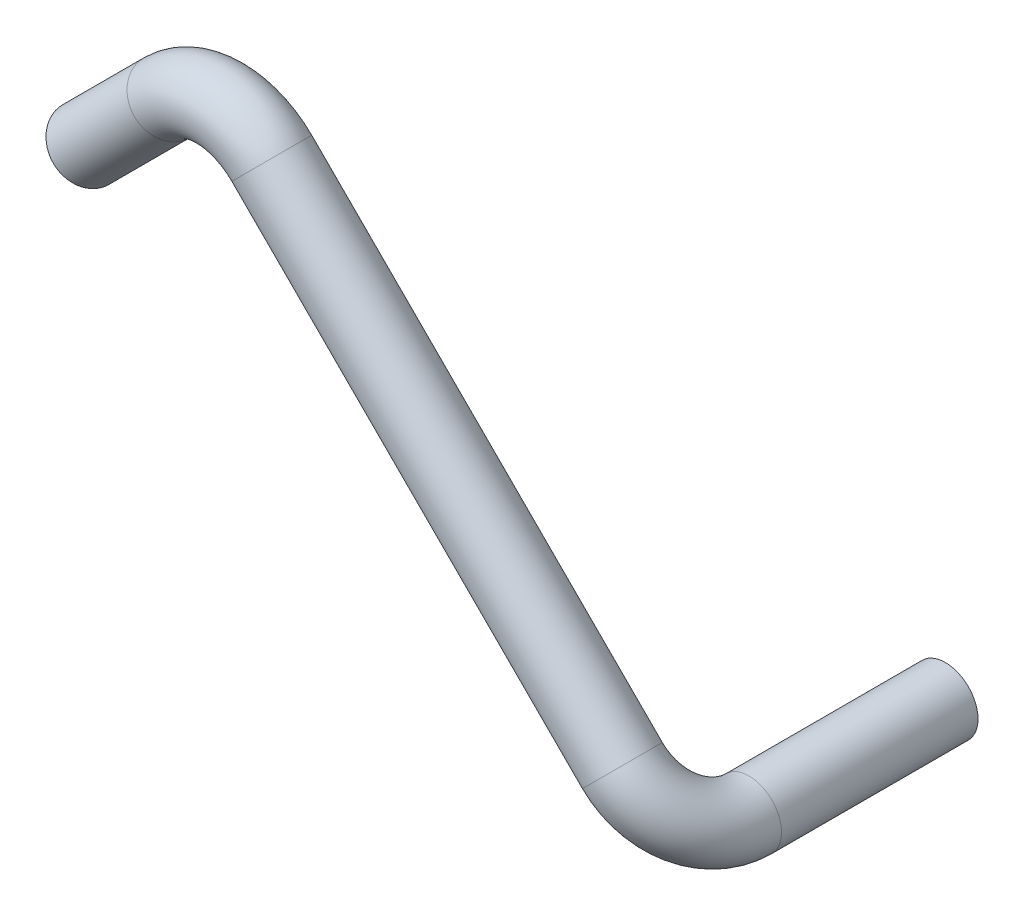
ISO-10303-21;
HEADER;
FILE_DESCRIPTION(('STEP AP214'),'2;1');
FILE_NAME('part.step','',(''),(''),'','','');
FILE_SCHEMA(('AUTOMOTIVE_DESIGN { 1 0 10303 214 1 1 1 1 }'));
ENDSEC;
DATA;
#1=APPLICATION_CONTEXT('core data for automotive mechanical design processes');
#2=APPLICATION_PROTOCOL_DEFINITION('international standard','automotive_design',2000,#1);
#3=PRODUCT_CONTEXT('',#1,'mechanical');
#4=PRODUCT('Part','Part','',(#3));
#5=PRODUCT_RELATED_PRODUCT_CATEGORY('part','',(#4));
#6=PRODUCT_DEFINITION_FORMATION('','',#4);
#7=PRODUCT_DEFINITION_CONTEXT('part definition',#1,'design');
#8=PRODUCT_DEFINITION('design','',#6,#7);
#9=PRODUCT_DEFINITION_SHAPE('','',#8);
#10=(LENGTH_UNIT() NAMED_UNIT(*) SI_UNIT(.MILLI.,.METRE.));
#11=(NAMED_UNIT(*) PLANE_ANGLE_UNIT() SI_UNIT($,.RADIAN.));
#12=(NAMED_UNIT(*) SI_UNIT($,.STERADIAN.) SOLID_ANGLE_UNIT());
#13=UNCERTAINTY_MEASURE_WITH_UNIT(LENGTH_MEASURE(1.E-05),#10,'distance_accuracy_value','');
#14=(GEOMETRIC_REPRESENTATION_CONTEXT(3) GLOBAL_UNCERTAINTY_ASSIGNED_CONTEXT((#13)) GLOBAL_UNIT_ASSIGNED_CONTEXT((#10,
#11,#12)) REPRESENTATION_CONTEXT('',''));
#15=CARTESIAN_POINT('',(0.,0.,0.));
#16=DIRECTION('',(0.,0.,1.));
#17=DIRECTION('',(1.,0.,0.));
#18=AXIS2_PLACEMENT_3D('',#15,#16,#17);
#19=CARTESIAN_POINT('',(0.,0.,0.));
#20=DIRECTION('',(0.,0.,1.));
#21=DIRECTION('',(1.,0.,0.));
#22=AXIS2_PLACEMENT_3D('',#19,#20,#21);
#23=PLANE('',#22);
#24=CARTESIAN_POINT('',(0.,0.,0.));
#25=DIRECTION('',(0.,0.,1.));
#26=DIRECTION('',(1.,0.,0.));
#27=AXIS2_PLACEMENT_3D('',#24,#25,#26);
#28=CIRCLE('',#27,16.764);
#29=CARTESIAN_POINT('',(16.764,0.,0.));
#30=VERTEX_POINT('',#29);
#31=EDGE_CURVE('E10',#30,#30,#28,.T.);
#32=ORIENTED_EDGE('',*,*,#31,.F.);
#33=EDGE_LOOP('',(#32));
#34=FACE_BOUND('',#33,.T.);
#35=CARTESIAN_POINT('',(0.,0.,0.));
#36=DIRECTION('',(0.,0.,1.));
#37=DIRECTION('',(1.,0.,0.));
#38=AXIS2_PLACEMENT_3D('',#35,#36,#37);
#39=CIRCLE('',#38,13.3858);
#40=CARTESIAN_POINT('',(13.3858,0.,0.));
#41=VERTEX_POINT('',#40);
#42=EDGE_CURVE('E38',#41,#41,#39,.T.);
#43=ORIENTED_EDGE('',*,*,#42,.T.);
#44=EDGE_LOOP('',(#43));
#45=FACE_BOUND('',#44,.T.);
#46=ADVANCED_FACE('F31',(#34,#45),#23,.F.);
#47=CARTESIAN_POINT('',(0.,0.,95.));
#48=DIRECTION('',(0.,0.,-1.));
#49=DIRECTION('',(-1.,0.,0.));
#50=AXIS2_PLACEMENT_3D('',#47,#48,#49);
#51=CYLINDRICAL_SURFACE('',#50,16.764);
#52=ORIENTED_EDGE('',*,*,#31,.T.);
#53=EDGE_LOOP('',(#52));
#54=FACE_BOUND('',#53,.T.);
#55=CARTESIAN_POINT('',(0.,0.,100.980008255021));
#56=DIRECTION('',(0.,0.,1.));
#57=DIRECTION('',(1.,0.,0.));
#58=AXIS2_PLACEMENT_3D('',#55,#56,#57);
#59=CIRCLE('',#58,16.764);
#60=CARTESIAN_POINT('',(11.8539380798113,-11.8539380798113,100.980008255021));
#61=VERTEX_POINT('',#60);
#62=EDGE_CURVE('E42',#61,#61,#59,.T.);
#63=ORIENTED_EDGE('',*,*,#62,.F.);
#64=EDGE_LOOP('',(#63));
#65=FACE_BOUND('',#64,.T.);
#66=ADVANCED_FACE('F33',(#54,#65),#51,.T.);
#67=CARTESIAN_POINT('',(0.,0.,95.));
#68=DIRECTION('',(0.,0.,-1.));
#69=DIRECTION('',(-1.,0.,0.));
#70=AXIS2_PLACEMENT_3D('',#67,#68,#69);
#71=CYLINDRICAL_SURFACE('',#70,13.3858);
#72=ORIENTED_EDGE('',*,*,#42,.F.);
#73=EDGE_LOOP('',(#72));
#74=FACE_BOUND('',#73,.T.);
#75=CARTESIAN_POINT('',(0.,0.,100.980008255021));
#76=DIRECTION('',(0.,0.,1.));
#77=DIRECTION('',(1.,0.,0.));
#78=AXIS2_PLACEMENT_3D('',#75,#76,#77);
#79=CIRCLE('',#78,13.3858);
#80=CARTESIAN_POINT('',(9.46518995160688,-9.46518995160688,100.980008255021));
#81=VERTEX_POINT('',#80);
#82=EDGE_CURVE('E51',#81,#81,#79,.T.);
#83=ORIENTED_EDGE('',*,*,#82,.T.);
#84=EDGE_LOOP('',(#83));
#85=FACE_BOUND('',#84,.T.);
#86=ADVANCED_FACE('F100',(#74,#85),#71,.F.);
#87=CARTESIAN_POINT('',(-26.9407683632075,26.9407683632075,100.980008255021));
#88=DIRECTION('',(0.707106781186548,0.707106781186548,0.));
#89=DIRECTION('',(-0.707106781186548,0.707106781186548,0.));
#90=AXIS2_PLACEMENT_3D('',#87,#88,#89);
#91=TOROIDAL_SURFACE('',#90,38.1,13.3858);
#92=CARTESIAN_POINT('',(-26.9407683632075,26.9407683632075,139.080008255021));
#93=DIRECTION('',(-0.707106781186548,0.707106781186547,0.));
#94=DIRECTION('',(-0.707106781186547,-0.707106781186548,0.));
#95=AXIS2_PLACEMENT_3D('',#92,#93,#94);
#96=CIRCLE('',#95,13.3858);
#97=CARTESIAN_POINT('',(-26.9407683632075,26.9407683632075,152.465808255021));
#98=VERTEX_POINT('',#97);
#99=EDGE_CURVE('E57',#98,#98,#96,.T.);
#100=CARTESIAN_POINT('',(-26.9407683632075,26.9407683632075,100.980008255021));
#101=DIRECTION('',(0.707106781186548,0.707106781186548,0.));
#102=DIRECTION('',(-0.707106781186548,0.707106781186548,0.));
#103=AXIS2_PLACEMENT_3D('',#100,#101,#102);
#104=CIRCLE('',#103,51.4858);
#105=EDGE_CURVE('',#98,#81,#104,.T.);
#106=ORIENTED_EDGE('',*,*,#99,.T.);
#107=ORIENTED_EDGE('',*,*,#82,.F.);
#108=ORIENTED_EDGE('',*,*,#105,.T.);
#109=ORIENTED_EDGE('',*,*,#105,.F.);
#110=EDGE_LOOP('',(#106,#108,#107,#109));
#111=FACE_BOUND('',#110,.T.);
#112=ADVANCED_FACE('F104',(#111),#91,.F.);
#113=CARTESIAN_POINT('',(-26.9407683632075,26.9407683632075,100.980008255021));
#114=DIRECTION('',(0.707106781186548,0.707106781186548,0.));
#115=DIRECTION('',(-0.707106781186548,0.707106781186548,0.));
#116=AXIS2_PLACEMENT_3D('',#113,#114,#115);
#117=TOROIDAL_SURFACE('',#116,38.1,16.764);
#118=CARTESIAN_POINT('',(-26.9407683632075,26.9407683632075,139.080008255021));
#119=DIRECTION('',(-0.707106781186548,0.707106781186548,0.));
#120=DIRECTION('',(0.5,0.5,0.707106781186548));
#121=AXIS2_PLACEMENT_3D('',#118,#119,#120);
#122=CIRCLE('',#121,16.764);
#123=CARTESIAN_POINT('',(-26.9407683632075,26.9407683632075,155.844008255021));
#124=VERTEX_POINT('',#123);
#125=EDGE_CURVE('E46',#124,#124,#122,.T.);
#126=CARTESIAN_POINT('',(-26.9407683632075,26.9407683632075,100.980008255021));
#127=DIRECTION('',(0.707106781186548,0.707106781186548,0.));
#128=DIRECTION('',(-0.707106781186548,0.707106781186548,0.));
#129=AXIS2_PLACEMENT_3D('',#126,#127,#128);
#130=CIRCLE('',#129,54.864);
#131=EDGE_CURVE('',#124,#61,#130,.T.);
#132=ORIENTED_EDGE('',*,*,#125,.F.);
#133=ORIENTED_EDGE('',*,*,#62,.T.);
#134=ORIENTED_EDGE('',*,*,#131,.T.);
#135=ORIENTED_EDGE('',*,*,#131,.F.);
#136=EDGE_LOOP('',(#132,#134,#133,#135));
#137=FACE_BOUND('',#136,.T.);
#138=ADVANCED_FACE('F106',(#137),#117,.T.);
#139=CARTESIAN_POINT('',(-207.18245502432,207.18245502432,139.080008255021));
#140=DIRECTION('',(0.707106781186548,-0.707106781186547,0.));
#141=DIRECTION('',(0.707106781186547,0.707106781186548,0.));
#142=AXIS2_PLACEMENT_3D('',#139,#140,#141);
#143=CYLINDRICAL_SURFACE('',#142,16.764);
#144=CARTESIAN_POINT('',(-207.18245502432,207.18245502432,139.080008255021));
#145=DIRECTION('',(-0.707106781186548,0.707106781186547,0.));
#146=DIRECTION('',(-0.707106781186547,-0.707106781186548,0.));
#147=AXIS2_PLACEMENT_3D('',#144,#145,#146);
#148=CIRCLE('',#147,16.764);
#149=CARTESIAN_POINT('',(-195.328516944508,219.036393104131,139.080008255021));
#150=VERTEX_POINT('',#149);
#151=EDGE_CURVE('E54',#150,#150,#148,.T.);
#152=ORIENTED_EDGE('',*,*,#151,.F.);
#153=EDGE_LOOP('',(#152));
#154=FACE_BOUND('',#153,.T.);
#155=ORIENTED_EDGE('',*,*,#125,.T.);
#156=EDGE_LOOP('',(#155));
#157=FACE_BOUND('',#156,.T.);
#158=ADVANCED_FACE('F109',(#154,#157),#143,.T.);
#159=CARTESIAN_POINT('',(-207.18245502432,207.18245502432,139.080008255021));
#160=DIRECTION('',(0.707106781186548,-0.707106781186547,0.));
#161=DIRECTION('',(0.707106781186547,0.707106781186548,0.));
#162=AXIS2_PLACEMENT_3D('',#159,#160,#161);
#163=CYLINDRICAL_SURFACE('',#162,13.3858);
#164=CARTESIAN_POINT('',(-207.18245502432,207.18245502432,139.080008255021));
#165=DIRECTION('',(-0.707106781186548,0.707106781186548,0.));
#166=DIRECTION('',(-0.707106781186548,-0.707106781186548,0.));
#167=AXIS2_PLACEMENT_3D('',#164,#165,#166);
#168=CIRCLE('',#167,13.3858);
#169=CARTESIAN_POINT('',(-197.717265072713,216.647644975927,139.080008255021));
#170=VERTEX_POINT('',#169);
#171=EDGE_CURVE('E63',#170,#170,#168,.T.);
#172=ORIENTED_EDGE('',*,*,#171,.T.);
#173=EDGE_LOOP('',(#172));
#174=FACE_BOUND('',#173,.T.);
#175=ORIENTED_EDGE('',*,*,#99,.F.);
#176=EDGE_LOOP('',(#175));
#177=FACE_BOUND('',#176,.T.);
#178=ADVANCED_FACE('F116',(#174,#177),#163,.F.);
#179=CARTESIAN_POINT('',(-234.123223387527,180.241686661112,139.080008255021));
#180=DIRECTION('',(0.,0.,-1.));
#181=DIRECTION('',(-1.,0.,0.));
#182=AXIS2_PLACEMENT_3D('',#179,#180,#181);
#183=TOROIDAL_SURFACE('',#182,38.0999999999998,13.3858);
#184=CARTESIAN_POINT('',(-261.063991750734,207.18245502432,139.080008255021));
#185=DIRECTION('',(-0.707106781186547,-0.707106781186548,0.));
#186=DIRECTION('',(0.707106781186548,-0.707106781186547,0.));
#187=AXIS2_PLACEMENT_3D('',#184,#185,#186);
#188=CIRCLE('',#187,13.3858);
#189=CARTESIAN_POINT('',(-270.529181702341,216.647644975927,139.080008255021));
#190=VERTEX_POINT('',#189);
#191=EDGE_CURVE('E70',#190,#190,#188,.T.);
#192=CARTESIAN_POINT('',(-234.123223387527,180.241686661112,139.080008255021));
#193=DIRECTION('',(0.,0.,-1.));
#194=DIRECTION('',(-1.,0.,0.));
#195=AXIS2_PLACEMENT_3D('',#192,#193,#194);
#196=CIRCLE('',#195,51.4857999999998);
#197=EDGE_CURVE('',#190,#170,#196,.T.);
#198=ORIENTED_EDGE('',*,*,#191,.T.);
#199=ORIENTED_EDGE('',*,*,#171,.F.);
#200=ORIENTED_EDGE('',*,*,#197,.T.);
#201=ORIENTED_EDGE('',*,*,#197,.F.);
#202=EDGE_LOOP('',(#198,#200,#199,#201));
#203=FACE_BOUND('',#202,.T.);
#204=ADVANCED_FACE('F91',(#203),#183,.F.);
#205=CARTESIAN_POINT('',(-234.123223387527,180.241686661112,139.080008255021));
#206=DIRECTION('',(0.,0.,-1.));
#207=DIRECTION('',(-1.,0.,0.));
#208=AXIS2_PLACEMENT_3D('',#205,#206,#207);
#209=TOROIDAL_SURFACE('',#208,38.0999999999998,16.764);
#210=CARTESIAN_POINT('',(-261.063991750734,207.18245502432,139.080008255021));
#211=DIRECTION('',(-0.707106781186547,-0.707106781186548,0.));
#212=DIRECTION('',(0.707106781186548,-0.707106781186547,0.));
#213=AXIS2_PLACEMENT_3D('',#210,#211,#212);
#214=CIRCLE('',#213,16.764);
#215=CARTESIAN_POINT('',(-272.917929830546,219.036393104131,139.080008255021));
#216=VERTEX_POINT('',#215);
#217=EDGE_CURVE('E60',#216,#216,#214,.T.);
#218=CARTESIAN_POINT('',(-234.123223387527,180.241686661112,139.080008255021));
#219=DIRECTION('',(0.,0.,-1.));
#220=DIRECTION('',(-1.,0.,0.));
#221=AXIS2_PLACEMENT_3D('',#218,#219,#220);
#222=CIRCLE('',#221,54.8639999999998);
#223=EDGE_CURVE('',#216,#150,#222,.T.);
#224=ORIENTED_EDGE('',*,*,#217,.F.);
#225=ORIENTED_EDGE('',*,*,#151,.T.);
#226=ORIENTED_EDGE('',*,*,#223,.T.);
#227=ORIENTED_EDGE('',*,*,#223,.F.);
#228=EDGE_LOOP('',(#224,#226,#225,#227));
#229=FACE_BOUND('',#228,.T.);
#230=ADVANCED_FACE('F82',(#229),#209,.T.);
#231=CARTESIAN_POINT('',(-302.712581162622,165.533865612432,139.080008255021));
#232=DIRECTION('',(-0.707106781186547,-0.707106781186548,0.));
#233=DIRECTION('',(0.707106781186548,-0.707106781186547,0.));
#234=AXIS2_PLACEMENT_3D('',#231,#232,#233);
#235=PLANE('',#234);
#236=CARTESIAN_POINT('',(-302.712581162622,165.533865612432,139.080008255021));
#237=DIRECTION('',(-0.707106781186547,-0.707106781186548,0.));
#238=DIRECTION('',(0.707106781186548,-0.707106781186547,0.));
#239=AXIS2_PLACEMENT_3D('',#236,#237,#238);
#240=CIRCLE('',#239,16.764);
#241=CARTESIAN_POINT('',(-290.858643082811,153.679927532621,139.080008255021));
#242=VERTEX_POINT('',#241);
#243=EDGE_CURVE('E66',#242,#242,#240,.T.);
#244=ORIENTED_EDGE('',*,*,#243,.T.);
#245=EDGE_LOOP('',(#244));
#246=FACE_BOUND('',#245,.T.);
#247=CARTESIAN_POINT('',(-302.712581162622,165.533865612432,139.080008255021));
#248=DIRECTION('',(-0.707106781186547,-0.707106781186548,0.));
#249=DIRECTION('',(0.707106781186548,-0.707106781186547,0.));
#250=AXIS2_PLACEMENT_3D('',#247,#248,#249);
#251=CIRCLE('',#250,13.3858);
#252=CARTESIAN_POINT('',(-293.247391211015,156.068675660825,139.080008255021));
#253=VERTEX_POINT('',#252);
#254=EDGE_CURVE('E69',#253,#253,#251,.T.);
#255=ORIENTED_EDGE('',*,*,#254,.F.);
#256=EDGE_LOOP('',(#255));
#257=FACE_BOUND('',#256,.T.);
#258=ADVANCED_FACE('F79',(#246,#257),#235,.T.);
#259=CARTESIAN_POINT('',(-302.712581162622,165.533865612432,139.080008255021));
#260=DIRECTION('',(0.707106781186547,0.707106781186548,0.));
#261=DIRECTION('',(-0.707106781186548,0.707106781186547,0.));
#262=AXIS2_PLACEMENT_3D('',#259,#260,#261);
#263=CYLINDRICAL_SURFACE('',#262,16.764);
#264=ORIENTED_EDGE('',*,*,#243,.F.);
#265=EDGE_LOOP('',(#264));
#266=FACE_BOUND('',#265,.T.);
#267=ORIENTED_EDGE('',*,*,#217,.T.);
#268=EDGE_LOOP('',(#267));
#269=FACE_BOUND('',#268,.T.);
#270=ADVANCED_FACE('F81',(#266,#269),#263,.T.);
#271=CARTESIAN_POINT('',(-302.712581162622,165.533865612432,139.080008255021));
#272=DIRECTION('',(0.707106781186547,0.707106781186548,0.));
#273=DIRECTION('',(-0.707106781186548,0.707106781186547,0.));
#274=AXIS2_PLACEMENT_3D('',#271,#272,#273);
#275=CYLINDRICAL_SURFACE('',#274,13.3858);
#276=ORIENTED_EDGE('',*,*,#254,.T.);
#277=EDGE_LOOP('',(#276));
#278=FACE_BOUND('',#277,.T.);
#279=ORIENTED_EDGE('',*,*,#191,.F.);
#280=EDGE_LOOP('',(#279));
#281=FACE_BOUND('',#280,.T.);
#282=ADVANCED_FACE('F76',(#278,#281),#275,.F.);
#283=CLOSED_SHELL('',(#46,#66,#86,#112,#138,#158,#178,#204,#230,#258,#270,#282));
#284=MANIFOLD_SOLID_BREP('B2',#283);
#285=ADVANCED_BREP_SHAPE_REPRESENTATION('',(#18,#284),#14);
#286=SHAPE_DEFINITION_REPRESENTATION(#9,#285);
ENDSEC;
END-ISO-10303-21;
